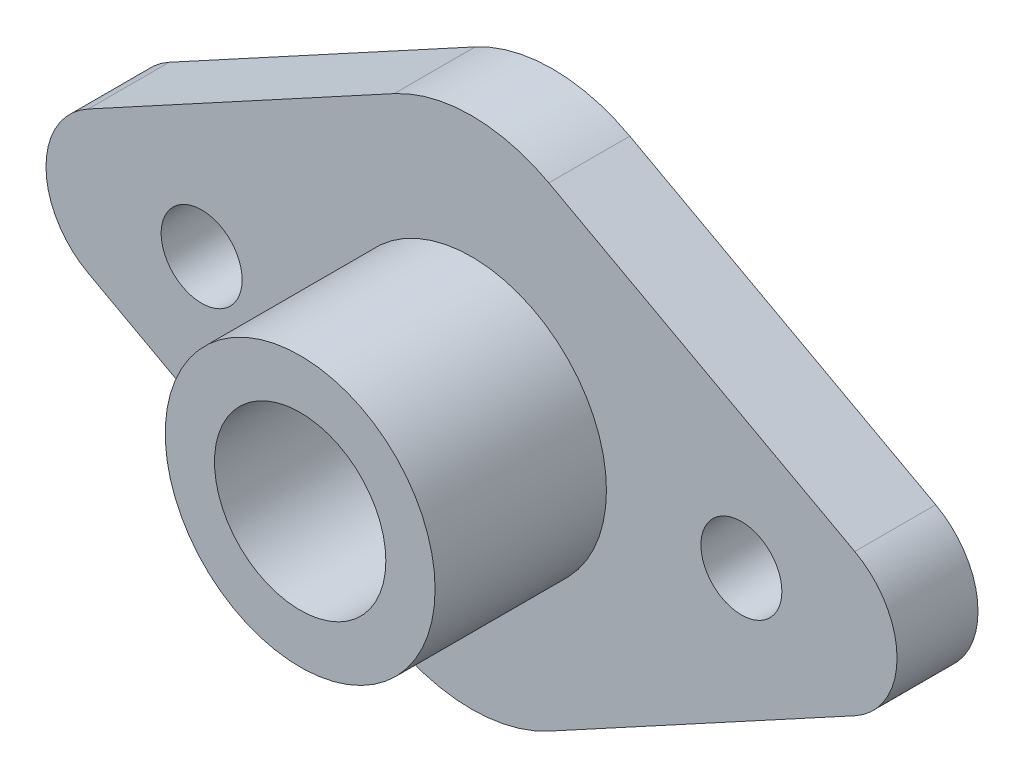
ISO-10303-21;
HEADER;
FILE_DESCRIPTION(('STEP AP214'),'2;1');
FILE_NAME('part.step','',(''),(''),'','','');
FILE_SCHEMA(('AUTOMOTIVE_DESIGN { 1 0 10303 214 1 1 1 1 }'));
ENDSEC;
DATA;
#1=APPLICATION_CONTEXT('core data for automotive mechanical design processes');
#2=APPLICATION_PROTOCOL_DEFINITION('international standard','automotive_design',2000,#1);
#3=PRODUCT_CONTEXT('',#1,'mechanical');
#4=PRODUCT('Part','Part','',(#3));
#5=PRODUCT_RELATED_PRODUCT_CATEGORY('part','',(#4));
#6=PRODUCT_DEFINITION_FORMATION('','',#4);
#7=PRODUCT_DEFINITION_CONTEXT('part definition',#1,'design');
#8=PRODUCT_DEFINITION('design','',#6,#7);
#9=PRODUCT_DEFINITION_SHAPE('','',#8);
#10=(LENGTH_UNIT() NAMED_UNIT(*) SI_UNIT(.MILLI.,.METRE.));
#11=(NAMED_UNIT(*) PLANE_ANGLE_UNIT() SI_UNIT($,.RADIAN.));
#12=(NAMED_UNIT(*) SI_UNIT($,.STERADIAN.) SOLID_ANGLE_UNIT());
#13=UNCERTAINTY_MEASURE_WITH_UNIT(LENGTH_MEASURE(1.E-05),#10,'distance_accuracy_value','');
#14=(GEOMETRIC_REPRESENTATION_CONTEXT(3) GLOBAL_UNCERTAINTY_ASSIGNED_CONTEXT((#13)) GLOBAL_UNIT_ASSIGNED_CONTEXT((#10,
#11,#12)) REPRESENTATION_CONTEXT('',''));
#15=CARTESIAN_POINT('',(0.,0.,0.));
#16=DIRECTION('',(0.,0.,1.));
#17=DIRECTION('',(1.,0.,0.));
#18=AXIS2_PLACEMENT_3D('',#15,#16,#17);
#19=CARTESIAN_POINT('',(0.,0.,3.));
#20=DIRECTION('',(0.,0.,1.));
#21=DIRECTION('',(1.,0.,0.));
#22=AXIS2_PLACEMENT_3D('',#19,#20,#21);
#23=PLANE('',#22);
#24=CARTESIAN_POINT('',(-10.,0.,3.));
#25=DIRECTION('',(0.,0.,1.));
#26=DIRECTION('',(1.,0.,0.));
#27=AXIS2_PLACEMENT_3D('',#24,#25,#26);
#28=CIRCLE('',#27,1.5);
#29=CARTESIAN_POINT('',(-8.5,0.,3.));
#30=VERTEX_POINT('',#29);
#31=EDGE_CURVE('E134',#30,#30,#28,.F.);
#32=ORIENTED_EDGE('',*,*,#31,.T.);
#33=EDGE_LOOP('',(#32));
#34=FACE_BOUND('',#33,.T.);
#35=CARTESIAN_POINT('',(10.,0.,3.));
#36=DIRECTION('',(0.,0.,1.));
#37=DIRECTION('',(1.,0.,0.));
#38=AXIS2_PLACEMENT_3D('',#35,#36,#37);
#39=CIRCLE('',#38,1.5);
#40=CARTESIAN_POINT('',(11.5,0.,3.));
#41=VERTEX_POINT('',#40);
#42=EDGE_CURVE('E128',#41,#41,#39,.T.);
#43=ORIENTED_EDGE('',*,*,#42,.F.);
#44=EDGE_LOOP('',(#43));
#45=FACE_BOUND('',#44,.T.);
#46=DIRECTION('',(-0.878610961129126,-0.477538248712869,0.));
#47=VECTOR('',#46,1.);
#48=CARTESIAN_POINT('',(-4.34421493964052,7.99281497085702,3.));
#49=LINE('',#48,#47);
#50=CARTESIAN_POINT('',(-2.86522949227722,8.79666576677474,3.));
#51=VERTEX_POINT('',#50);
#52=CARTESIAN_POINT('',(-14.2003954514831,2.63583288338737,3.));
#53=VERTEX_POINT('',#52);
#54=EDGE_CURVE('E166',#51,#53,#49,.T.);
#55=ORIENTED_EDGE('',*,*,#54,.T.);
#56=CARTESIAN_POINT('',(-12.7677807053445,0.,3.));
#57=DIRECTION('',(0.,0.,1.));
#58=DIRECTION('',(1.,0.,0.));
#59=AXIS2_PLACEMENT_3D('',#56,#57,#58);
#60=CIRCLE('',#59,3.);
#61=CARTESIAN_POINT('',(-14.2003954514831,-2.63583288338738,3.));
#62=VERTEX_POINT('',#61);
#63=EDGE_CURVE('E89',#53,#62,#60,.T.);
#64=ORIENTED_EDGE('',*,*,#63,.T.);
#65=DIRECTION('',(-0.878610961129126,0.477538248712869,0.));
#66=VECTOR('',#65,1.);
#67=CARTESIAN_POINT('',(-4.34421493964052,-7.99281497085702,3.));
#68=LINE('',#67,#66);
#69=CARTESIAN_POINT('',(-2.86522949227722,-8.79666576677475,3.));
#70=VERTEX_POINT('',#69);
#71=EDGE_CURVE('E179',#70,#62,#68,.T.);
#72=ORIENTED_EDGE('',*,*,#71,.F.);
#73=CARTESIAN_POINT('',(0.,-3.525,3.));
#74=DIRECTION('',(0.,0.,1.));
#75=DIRECTION('',(1.,0.,0.));
#76=AXIS2_PLACEMENT_3D('',#73,#74,#75);
#77=CIRCLE('',#76,6.);
#78=CARTESIAN_POINT('',(2.86522949227722,-8.79666576677474,3.));
#79=VERTEX_POINT('',#78);
#80=EDGE_CURVE('E193',#70,#79,#77,.T.);
#81=ORIENTED_EDGE('',*,*,#80,.T.);
#82=DIRECTION('',(0.878610961129126,0.477538248712869,0.));
#83=VECTOR('',#82,1.);
#84=CARTESIAN_POINT('',(4.34421493964052,-7.99281497085702,3.));
#85=LINE('',#84,#83);
#86=CARTESIAN_POINT('',(14.2003954514831,-2.63583288338737,3.));
#87=VERTEX_POINT('',#86);
#88=EDGE_CURVE('E122',#79,#87,#85,.T.);
#89=ORIENTED_EDGE('',*,*,#88,.T.);
#90=CARTESIAN_POINT('',(12.7677807053445,0.,3.));
#91=DIRECTION('',(0.,0.,1.));
#92=DIRECTION('',(1.,0.,0.));
#93=AXIS2_PLACEMENT_3D('',#90,#91,#92);
#94=CIRCLE('',#93,2.99999999999999);
#95=CARTESIAN_POINT('',(14.2003954514831,2.63583288338737,3.));
#96=VERTEX_POINT('',#95);
#97=EDGE_CURVE('E108',#96,#87,#94,.F.);
#98=ORIENTED_EDGE('',*,*,#97,.F.);
#99=DIRECTION('',(0.878610961129126,-0.477538248712869,0.));
#100=VECTOR('',#99,1.);
#101=CARTESIAN_POINT('',(4.34421493964052,7.99281497085702,3.));
#102=LINE('',#101,#100);
#103=CARTESIAN_POINT('',(2.86522949227722,8.79666576677474,3.));
#104=VERTEX_POINT('',#103);
#105=EDGE_CURVE('E120',#104,#96,#102,.T.);
#106=ORIENTED_EDGE('',*,*,#105,.F.);
#107=CARTESIAN_POINT('',(0.,3.525,3.));
#108=DIRECTION('',(0.,0.,1.));
#109=DIRECTION('',(1.,0.,0.));
#110=AXIS2_PLACEMENT_3D('',#107,#108,#109);
#111=CIRCLE('',#110,6.);
#112=EDGE_CURVE('E126',#51,#104,#111,.F.);
#113=ORIENTED_EDGE('',*,*,#112,.F.);
#114=EDGE_LOOP('',(#55,#64,#72,#81,#89,#98,#106,#113));
#115=FACE_BOUND('',#114,.T.);
#116=CARTESIAN_POINT('',(0.,0.,3.));
#117=DIRECTION('',(0.,0.,1.));
#118=DIRECTION('',(1.,0.,0.));
#119=AXIS2_PLACEMENT_3D('',#116,#117,#118);
#120=CIRCLE('',#119,5.);
#121=CARTESIAN_POINT('',(5.,0.,3.));
#122=VERTEX_POINT('',#121);
#123=EDGE_CURVE('E199',#122,#122,#120,.T.);
#124=ORIENTED_EDGE('',*,*,#123,.F.);
#125=EDGE_LOOP('',(#124));
#126=FACE_BOUND('',#125,.T.);
#127=ADVANCED_FACE('F34',(#34,#45,#115,#126),#23,.T.);
#128=CARTESIAN_POINT('',(-4.34421493964052,7.99281497085702,3.));
#129=DIRECTION('',(0.477538248712869,-0.878610961129126,0.));
#130=DIRECTION('',(0.878610961129126,0.477538248712869,0.));
#131=AXIS2_PLACEMENT_3D('',#128,#129,#130);
#132=PLANE('',#131);
#133=DIRECTION('',(-0.878610961129126,-0.477538248712869,0.));
#134=VECTOR('',#133,1.);
#135=CARTESIAN_POINT('',(-4.34421493964052,7.99281497085702,0.));
#136=LINE('',#135,#134);
#137=CARTESIAN_POINT('',(-2.86522949227722,8.79666576677474,0.));
#138=VERTEX_POINT('',#137);
#139=CARTESIAN_POINT('',(-14.2003954514831,2.63583288338737,0.));
#140=VERTEX_POINT('',#139);
#141=EDGE_CURVE('E137',#138,#140,#136,.T.);
#142=ORIENTED_EDGE('',*,*,#141,.T.);
#143=DIRECTION('',(0.,0.,-1.));
#144=VECTOR('',#143,1.);
#145=CARTESIAN_POINT('',(-14.2003954514831,2.63583288338737,3.));
#146=LINE('',#145,#144);
#147=EDGE_CURVE('E11',#53,#140,#146,.T.);
#148=ORIENTED_EDGE('',*,*,#147,.F.);
#149=ORIENTED_EDGE('',*,*,#54,.F.);
#150=DIRECTION('',(0.,0.,-1.));
#151=VECTOR('',#150,1.);
#152=CARTESIAN_POINT('',(-2.86522949227722,8.79666576677474,3.));
#153=LINE('',#152,#151);
#154=EDGE_CURVE('E51',#51,#138,#153,.T.);
#155=ORIENTED_EDGE('',*,*,#154,.T.);
#156=EDGE_LOOP('',(#142,#148,#149,#155));
#157=FACE_BOUND('',#156,.T.);
#158=ADVANCED_FACE('F36',(#157),#132,.F.);
#159=CARTESIAN_POINT('',(-12.7677807053445,0.,3.));
#160=DIRECTION('',(0.,0.,-1.));
#161=DIRECTION('',(-1.,0.,0.));
#162=AXIS2_PLACEMENT_3D('',#159,#160,#161);
#163=CYLINDRICAL_SURFACE('',#162,3.);
#164=CARTESIAN_POINT('',(-12.7677807053445,0.,0.));
#165=DIRECTION('',(0.,0.,1.));
#166=DIRECTION('',(1.,0.,0.));
#167=AXIS2_PLACEMENT_3D('',#164,#165,#166);
#168=CIRCLE('',#167,3.);
#169=CARTESIAN_POINT('',(-14.2003954514831,-2.63583288338738,0.));
#170=VERTEX_POINT('',#169);
#171=EDGE_CURVE('E139',#140,#170,#168,.T.);
#172=ORIENTED_EDGE('',*,*,#171,.T.);
#173=DIRECTION('',(0.,0.,-1.));
#174=VECTOR('',#173,1.);
#175=CARTESIAN_POINT('',(-14.2003954514831,-2.63583288338738,3.));
#176=LINE('',#175,#174);
#177=EDGE_CURVE('E43',#62,#170,#176,.T.);
#178=ORIENTED_EDGE('',*,*,#177,.F.);
#179=ORIENTED_EDGE('',*,*,#63,.F.);
#180=ORIENTED_EDGE('',*,*,#147,.T.);
#181=EDGE_LOOP('',(#172,#178,#179,#180));
#182=FACE_BOUND('',#181,.T.);
#183=ADVANCED_FACE('F180',(#182),#163,.T.);
#184=CARTESIAN_POINT('',(-4.34421493964052,-7.99281497085702,3.));
#185=DIRECTION('',(-0.477538248712869,-0.878610961129126,0.));
#186=DIRECTION('',(0.878610961129126,-0.477538248712869,0.));
#187=AXIS2_PLACEMENT_3D('',#184,#185,#186);
#188=PLANE('',#187);
#189=DIRECTION('',(-0.878610961129126,0.477538248712869,0.));
#190=VECTOR('',#189,1.);
#191=CARTESIAN_POINT('',(-4.34421493964052,-7.99281497085702,0.));
#192=LINE('',#191,#190);
#193=CARTESIAN_POINT('',(-2.86522949227722,-8.79666576677475,0.));
#194=VERTEX_POINT('',#193);
#195=EDGE_CURVE('E143',#194,#170,#192,.T.);
#196=ORIENTED_EDGE('',*,*,#195,.F.);
#197=DIRECTION('',(0.,0.,-1.));
#198=VECTOR('',#197,1.);
#199=CARTESIAN_POINT('',(-2.86522949227722,-8.79666576677475,3.));
#200=LINE('',#199,#198);
#201=EDGE_CURVE('E173',#70,#194,#200,.T.);
#202=ORIENTED_EDGE('',*,*,#201,.F.);
#203=ORIENTED_EDGE('',*,*,#71,.T.);
#204=ORIENTED_EDGE('',*,*,#177,.T.);
#205=EDGE_LOOP('',(#196,#202,#203,#204));
#206=FACE_BOUND('',#205,.T.);
#207=ADVANCED_FACE('F177',(#206),#188,.T.);
#208=CARTESIAN_POINT('',(0.,-3.525,3.));
#209=DIRECTION('',(0.,0.,-1.));
#210=DIRECTION('',(-1.,0.,0.));
#211=AXIS2_PLACEMENT_3D('',#208,#209,#210);
#212=CYLINDRICAL_SURFACE('',#211,6.);
#213=CARTESIAN_POINT('',(0.,-3.525,0.));
#214=DIRECTION('',(0.,0.,1.));
#215=DIRECTION('',(1.,0.,0.));
#216=AXIS2_PLACEMENT_3D('',#213,#214,#215);
#217=CIRCLE('',#216,6.);
#218=CARTESIAN_POINT('',(2.86522949227722,-8.79666576677474,0.));
#219=VERTEX_POINT('',#218);
#220=EDGE_CURVE('E146',#194,#219,#217,.T.);
#221=ORIENTED_EDGE('',*,*,#220,.T.);
#222=DIRECTION('',(0.,0.,-1.));
#223=VECTOR('',#222,1.);
#224=CARTESIAN_POINT('',(2.86522949227722,-8.79666576677474,3.));
#225=LINE('',#224,#223);
#226=EDGE_CURVE('E170',#79,#219,#225,.T.);
#227=ORIENTED_EDGE('',*,*,#226,.F.);
#228=ORIENTED_EDGE('',*,*,#80,.F.);
#229=ORIENTED_EDGE('',*,*,#201,.T.);
#230=EDGE_LOOP('',(#221,#227,#228,#229));
#231=FACE_BOUND('',#230,.T.);
#232=ADVANCED_FACE('F189',(#231),#212,.T.);
#233=CARTESIAN_POINT('',(4.34421493964052,-7.99281497085702,3.));
#234=DIRECTION('',(-0.477538248712869,0.878610961129126,0.));
#235=DIRECTION('',(-0.878610961129126,-0.477538248712869,0.));
#236=AXIS2_PLACEMENT_3D('',#233,#234,#235);
#237=PLANE('',#236);
#238=DIRECTION('',(0.878610961129126,0.477538248712869,0.));
#239=VECTOR('',#238,1.);
#240=CARTESIAN_POINT('',(4.34421493964052,-7.99281497085702,0.));
#241=LINE('',#240,#239);
#242=CARTESIAN_POINT('',(14.2003954514831,-2.63583288338737,0.));
#243=VERTEX_POINT('',#242);
#244=EDGE_CURVE('E148',#219,#243,#241,.T.);
#245=ORIENTED_EDGE('',*,*,#244,.T.);
#246=DIRECTION('',(0.,0.,-1.));
#247=VECTOR('',#246,1.);
#248=CARTESIAN_POINT('',(14.2003954514831,-2.63583288338737,3.));
#249=LINE('',#248,#247);
#250=EDGE_CURVE('E114',#87,#243,#249,.T.);
#251=ORIENTED_EDGE('',*,*,#250,.F.);
#252=ORIENTED_EDGE('',*,*,#88,.F.);
#253=ORIENTED_EDGE('',*,*,#226,.T.);
#254=EDGE_LOOP('',(#245,#251,#252,#253));
#255=FACE_BOUND('',#254,.T.);
#256=ADVANCED_FACE('F192',(#255),#237,.F.);
#257=CARTESIAN_POINT('',(12.7677807053445,0.,3.));
#258=DIRECTION('',(0.,0.,-1.));
#259=DIRECTION('',(-1.,0.,0.));
#260=AXIS2_PLACEMENT_3D('',#257,#258,#259);
#261=CYLINDRICAL_SURFACE('',#260,2.99999999999999);
#262=CARTESIAN_POINT('',(12.7677807053445,0.,0.));
#263=DIRECTION('',(0.,0.,1.));
#264=DIRECTION('',(1.,0.,0.));
#265=AXIS2_PLACEMENT_3D('',#262,#263,#264);
#266=CIRCLE('',#265,2.99999999999999);
#267=CARTESIAN_POINT('',(14.2003954514831,2.63583288338737,0.));
#268=VERTEX_POINT('',#267);
#269=EDGE_CURVE('E110',#268,#243,#266,.F.);
#270=ORIENTED_EDGE('',*,*,#269,.F.);
#271=DIRECTION('',(0.,0.,-1.));
#272=VECTOR('',#271,1.);
#273=CARTESIAN_POINT('',(14.2003954514831,2.63583288338737,3.));
#274=LINE('',#273,#272);
#275=EDGE_CURVE('E105',#96,#268,#274,.T.);
#276=ORIENTED_EDGE('',*,*,#275,.F.);
#277=ORIENTED_EDGE('',*,*,#97,.T.);
#278=ORIENTED_EDGE('',*,*,#250,.T.);
#279=EDGE_LOOP('',(#270,#276,#277,#278));
#280=FACE_BOUND('',#279,.T.);
#281=ADVANCED_FACE('F107',(#280),#261,.T.);
#282=CARTESIAN_POINT('',(4.34421493964052,7.99281497085702,3.));
#283=DIRECTION('',(0.477538248712869,0.878610961129126,0.));
#284=DIRECTION('',(-0.878610961129126,0.477538248712869,0.));
#285=AXIS2_PLACEMENT_3D('',#282,#283,#284);
#286=PLANE('',#285);
#287=DIRECTION('',(0.878610961129126,-0.477538248712869,0.));
#288=VECTOR('',#287,1.);
#289=CARTESIAN_POINT('',(4.34421493964052,7.99281497085702,0.));
#290=LINE('',#289,#288);
#291=CARTESIAN_POINT('',(2.86522949227722,8.79666576677474,0.));
#292=VERTEX_POINT('',#291);
#293=EDGE_CURVE('E152',#292,#268,#290,.T.);
#294=ORIENTED_EDGE('',*,*,#293,.F.);
#295=DIRECTION('',(0.,0.,-1.));
#296=VECTOR('',#295,1.);
#297=CARTESIAN_POINT('',(2.86522949227722,8.79666576677474,3.));
#298=LINE('',#297,#296);
#299=EDGE_CURVE('E77',#104,#292,#298,.T.);
#300=ORIENTED_EDGE('',*,*,#299,.F.);
#301=ORIENTED_EDGE('',*,*,#105,.T.);
#302=ORIENTED_EDGE('',*,*,#275,.T.);
#303=EDGE_LOOP('',(#294,#300,#301,#302));
#304=FACE_BOUND('',#303,.T.);
#305=ADVANCED_FACE('F125',(#304),#286,.T.);
#306=CARTESIAN_POINT('',(10.,0.,3.));
#307=DIRECTION('',(0.,0.,-1.));
#308=DIRECTION('',(-1.,0.,0.));
#309=AXIS2_PLACEMENT_3D('',#306,#307,#308);
#310=CYLINDRICAL_SURFACE('',#309,1.5);
#311=ORIENTED_EDGE('',*,*,#42,.T.);
#312=EDGE_LOOP('',(#311));
#313=FACE_BOUND('',#312,.T.);
#314=CARTESIAN_POINT('',(10.,0.,0.));
#315=DIRECTION('',(0.,0.,1.));
#316=DIRECTION('',(1.,0.,0.));
#317=AXIS2_PLACEMENT_3D('',#314,#315,#316);
#318=CIRCLE('',#317,1.5);
#319=CARTESIAN_POINT('',(11.5,0.,0.));
#320=VERTEX_POINT('',#319);
#321=EDGE_CURVE('E160',#320,#320,#318,.T.);
#322=ORIENTED_EDGE('',*,*,#321,.F.);
#323=EDGE_LOOP('',(#322));
#324=FACE_BOUND('',#323,.T.);
#325=ADVANCED_FACE('F235',(#313,#324),#310,.F.);
#326=CARTESIAN_POINT('',(0.,0.,3.));
#327=DIRECTION('',(0.,0.,-1.));
#328=DIRECTION('',(-1.,0.,0.));
#329=AXIS2_PLACEMENT_3D('',#326,#327,#328);
#330=CYLINDRICAL_SURFACE('',#329,3.175);
#331=CARTESIAN_POINT('',(0.,0.,0.));
#332=DIRECTION('',(0.,0.,1.));
#333=DIRECTION('',(1.,0.,0.));
#334=AXIS2_PLACEMENT_3D('',#331,#332,#333);
#335=CIRCLE('',#334,3.175);
#336=CARTESIAN_POINT('',(3.175,0.,0.));
#337=VERTEX_POINT('',#336);
#338=EDGE_CURVE('E157',#337,#337,#335,.T.);
#339=ORIENTED_EDGE('',*,*,#338,.F.);
#340=EDGE_LOOP('',(#339));
#341=FACE_BOUND('',#340,.T.);
#342=CARTESIAN_POINT('',(0.,0.,9.35));
#343=DIRECTION('',(0.,0.,1.));
#344=DIRECTION('',(1.,0.,0.));
#345=AXIS2_PLACEMENT_3D('',#342,#343,#344);
#346=CIRCLE('',#345,3.175);
#347=CARTESIAN_POINT('',(3.175,0.,9.35));
#348=VERTEX_POINT('',#347);
#349=EDGE_CURVE('E202',#348,#348,#346,.T.);
#350=ORIENTED_EDGE('',*,*,#349,.T.);
#351=EDGE_LOOP('',(#350));
#352=FACE_BOUND('',#351,.T.);
#353=ADVANCED_FACE('F208',(#341,#352),#330,.F.);
#354=CARTESIAN_POINT('',(0.,3.525,3.));
#355=DIRECTION('',(0.,0.,-1.));
#356=DIRECTION('',(-1.,0.,0.));
#357=AXIS2_PLACEMENT_3D('',#354,#355,#356);
#358=CYLINDRICAL_SURFACE('',#357,6.);
#359=CARTESIAN_POINT('',(0.,3.525,0.));
#360=DIRECTION('',(0.,0.,1.));
#361=DIRECTION('',(1.,0.,0.));
#362=AXIS2_PLACEMENT_3D('',#359,#360,#361);
#363=CIRCLE('',#362,6.);
#364=EDGE_CURVE('E154',#138,#292,#363,.F.);
#365=ORIENTED_EDGE('',*,*,#364,.F.);
#366=ORIENTED_EDGE('',*,*,#154,.F.);
#367=ORIENTED_EDGE('',*,*,#112,.T.);
#368=ORIENTED_EDGE('',*,*,#299,.T.);
#369=EDGE_LOOP('',(#365,#366,#367,#368));
#370=FACE_BOUND('',#369,.T.);
#371=ADVANCED_FACE('F233',(#370),#358,.T.);
#372=CARTESIAN_POINT('',(-10.,0.,3.));
#373=DIRECTION('',(0.,0.,-1.));
#374=DIRECTION('',(-1.,0.,0.));
#375=AXIS2_PLACEMENT_3D('',#372,#373,#374);
#376=CYLINDRICAL_SURFACE('',#375,1.5);
#377=ORIENTED_EDGE('',*,*,#31,.F.);
#378=EDGE_LOOP('',(#377));
#379=FACE_BOUND('',#378,.T.);
#380=CARTESIAN_POINT('',(-10.,0.,0.));
#381=DIRECTION('',(0.,0.,1.));
#382=DIRECTION('',(1.,0.,0.));
#383=AXIS2_PLACEMENT_3D('',#380,#381,#382);
#384=CIRCLE('',#383,1.5);
#385=CARTESIAN_POINT('',(-8.5,0.,0.));
#386=VERTEX_POINT('',#385);
#387=EDGE_CURVE('E163',#386,#386,#384,.F.);
#388=ORIENTED_EDGE('',*,*,#387,.T.);
#389=EDGE_LOOP('',(#388));
#390=FACE_BOUND('',#389,.T.);
#391=ADVANCED_FACE('F221',(#379,#390),#376,.F.);
#392=CARTESIAN_POINT('',(0.,0.,0.));
#393=DIRECTION('',(0.,0.,1.));
#394=DIRECTION('',(1.,0.,0.));
#395=AXIS2_PLACEMENT_3D('',#392,#393,#394);
#396=PLANE('',#395);
#397=ORIENTED_EDGE('',*,*,#141,.F.);
#398=ORIENTED_EDGE('',*,*,#364,.T.);
#399=ORIENTED_EDGE('',*,*,#293,.T.);
#400=ORIENTED_EDGE('',*,*,#269,.T.);
#401=ORIENTED_EDGE('',*,*,#244,.F.);
#402=ORIENTED_EDGE('',*,*,#220,.F.);
#403=ORIENTED_EDGE('',*,*,#195,.T.);
#404=ORIENTED_EDGE('',*,*,#171,.F.);
#405=EDGE_LOOP('',(#397,#398,#399,#400,#401,#402,#403,#404));
#406=FACE_BOUND('',#405,.T.);
#407=ORIENTED_EDGE('',*,*,#338,.T.);
#408=EDGE_LOOP('',(#407));
#409=FACE_BOUND('',#408,.T.);
#410=ORIENTED_EDGE('',*,*,#321,.T.);
#411=EDGE_LOOP('',(#410));
#412=FACE_BOUND('',#411,.T.);
#413=ORIENTED_EDGE('',*,*,#387,.F.);
#414=EDGE_LOOP('',(#413));
#415=FACE_BOUND('',#414,.T.);
#416=ADVANCED_FACE('F184',(#406,#409,#412,#415),#396,.F.);
#417=CARTESIAN_POINT('',(0.,0.,9.35));
#418=DIRECTION('',(0.,0.,1.));
#419=DIRECTION('',(1.,0.,0.));
#420=AXIS2_PLACEMENT_3D('',#417,#418,#419);
#421=PLANE('',#420);
#422=CARTESIAN_POINT('',(0.,0.,9.35));
#423=DIRECTION('',(0.,0.,1.));
#424=DIRECTION('',(1.,0.,0.));
#425=AXIS2_PLACEMENT_3D('',#422,#423,#424);
#426=CIRCLE('',#425,5.);
#427=CARTESIAN_POINT('',(5.,0.,9.35));
#428=VERTEX_POINT('',#427);
#429=EDGE_CURVE('E140',#428,#428,#426,.T.);
#430=ORIENTED_EDGE('',*,*,#429,.T.);
#431=EDGE_LOOP('',(#430));
#432=FACE_BOUND('',#431,.T.);
#433=ORIENTED_EDGE('',*,*,#349,.F.);
#434=EDGE_LOOP('',(#433));
#435=FACE_BOUND('',#434,.T.);
#436=ADVANCED_FACE('F210',(#432,#435),#421,.T.);
#437=CARTESIAN_POINT('',(0.,0.,9.35));
#438=DIRECTION('',(0.,0.,-1.));
#439=DIRECTION('',(-1.,0.,0.));
#440=AXIS2_PLACEMENT_3D('',#437,#438,#439);
#441=CYLINDRICAL_SURFACE('',#440,5.);
#442=ORIENTED_EDGE('',*,*,#429,.F.);
#443=EDGE_LOOP('',(#442));
#444=FACE_BOUND('',#443,.T.);
#445=ORIENTED_EDGE('',*,*,#123,.T.);
#446=EDGE_LOOP('',(#445));
#447=FACE_BOUND('',#446,.T.);
#448=ADVANCED_FACE('F212',(#444,#447),#441,.T.);
#449=CLOSED_SHELL('',(#127,#158,#183,#207,#232,#256,#281,#305,#325,#353,#371,#391,#416,#436,#448));
#450=MANIFOLD_SOLID_BREP('B2',#449);
#451=ADVANCED_BREP_SHAPE_REPRESENTATION('',(#18,#450),#14);
#452=SHAPE_DEFINITION_REPRESENTATION(#9,#451);
ENDSEC;
END-ISO-10303-21;
